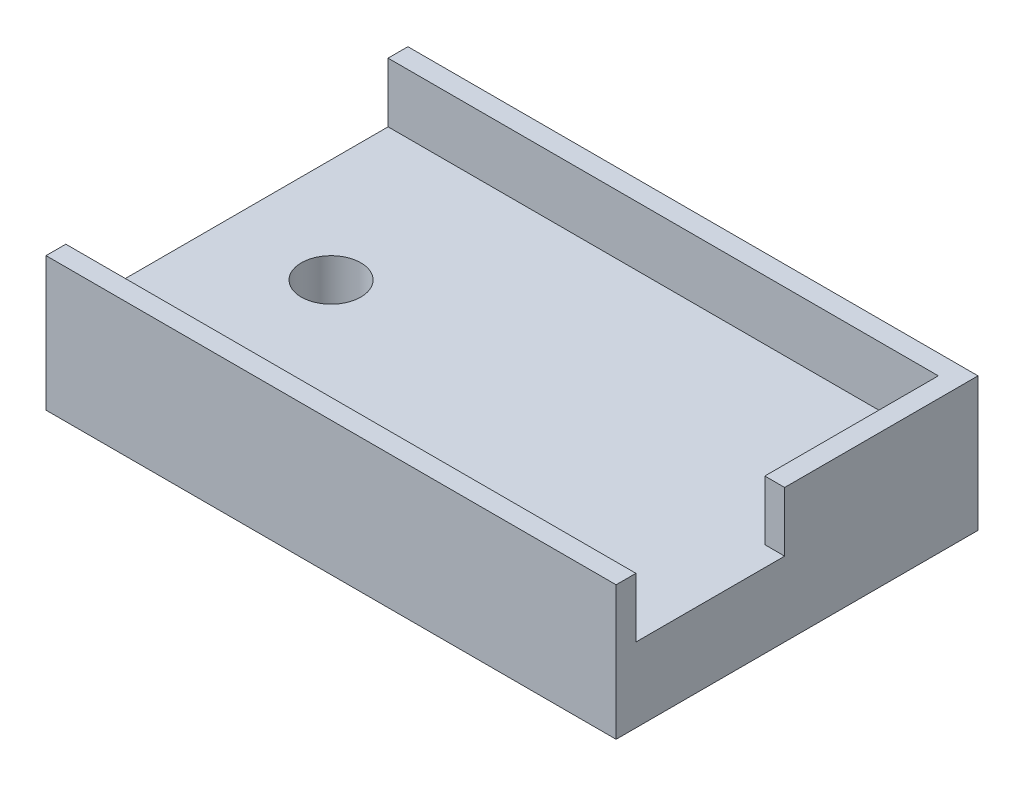
ISO-10303-21;
HEADER;
FILE_DESCRIPTION(('STEP AP214'),'2;1');
FILE_NAME('part.step','',(''),(''),'','','');
FILE_SCHEMA(('AUTOMOTIVE_DESIGN { 1 0 10303 214 1 1 1 1 }'));
ENDSEC;
DATA;
#1=APPLICATION_CONTEXT('core data for automotive mechanical design processes');
#2=APPLICATION_PROTOCOL_DEFINITION('international standard','automotive_design',2000,#1);
#3=PRODUCT_CONTEXT('',#1,'mechanical');
#4=PRODUCT('Part','Part','',(#3));
#5=PRODUCT_RELATED_PRODUCT_CATEGORY('part','',(#4));
#6=PRODUCT_DEFINITION_FORMATION('','',#4);
#7=PRODUCT_DEFINITION_CONTEXT('part definition',#1,'design');
#8=PRODUCT_DEFINITION('design','',#6,#7);
#9=PRODUCT_DEFINITION_SHAPE('','',#8);
#10=(LENGTH_UNIT() NAMED_UNIT(*) SI_UNIT(.MILLI.,.METRE.));
#11=(NAMED_UNIT(*) PLANE_ANGLE_UNIT() SI_UNIT($,.RADIAN.));
#12=(NAMED_UNIT(*) SI_UNIT($,.STERADIAN.) SOLID_ANGLE_UNIT());
#13=UNCERTAINTY_MEASURE_WITH_UNIT(LENGTH_MEASURE(1.E-05),#10,'distance_accuracy_value','');
#14=(GEOMETRIC_REPRESENTATION_CONTEXT(3) GLOBAL_UNCERTAINTY_ASSIGNED_CONTEXT((#13)) GLOBAL_UNIT_ASSIGNED_CONTEXT((#10,
#11,#12)) REPRESENTATION_CONTEXT('',''));
#15=CARTESIAN_POINT('',(0.,0.,0.));
#16=DIRECTION('',(0.,0.,1.));
#17=DIRECTION('',(1.,0.,0.));
#18=AXIS2_PLACEMENT_3D('',#15,#16,#17);
#19=CARTESIAN_POINT('',(11.5,3.,-7.3));
#20=DIRECTION('',(-1.,0.,0.));
#21=DIRECTION('',(0.,0.,1.));
#22=AXIS2_PLACEMENT_3D('',#19,#20,#21);
#23=PLANE('',#22);
#24=DIRECTION('',(0.,0.,-1.));
#25=VECTOR('',#24,1.);
#26=CARTESIAN_POINT('',(11.5,0.,-7.3));
#27=LINE('',#26,#25);
#28=CARTESIAN_POINT('',(11.5,0.,7.3));
#29=VERTEX_POINT('',#28);
#30=CARTESIAN_POINT('',(11.5,0.,-7.3));
#31=VERTEX_POINT('',#30);
#32=EDGE_CURVE('E170',#29,#31,#27,.T.);
#33=ORIENTED_EDGE('',*,*,#32,.T.);
#34=DIRECTION('',(0.,-1.,0.));
#35=VECTOR('',#34,1.);
#36=CARTESIAN_POINT('',(11.5,3.,-7.3));
#37=LINE('',#36,#35);
#38=CARTESIAN_POINT('',(11.5,5.4,-7.3));
#39=VERTEX_POINT('',#38);
#40=EDGE_CURVE('E11',#39,#31,#37,.T.);
#41=ORIENTED_EDGE('',*,*,#40,.F.);
#42=DIRECTION('',(0.,0.,-1.));
#43=VECTOR('',#42,1.);
#44=CARTESIAN_POINT('',(11.5,5.4,-7.3));
#45=LINE('',#44,#43);
#46=CARTESIAN_POINT('',(11.5,5.4,0.499999999999997));
#47=VERTEX_POINT('',#46);
#48=EDGE_CURVE('E209',#47,#39,#45,.T.);
#49=ORIENTED_EDGE('',*,*,#48,.F.);
#50=DIRECTION('',(0.,-1.,0.));
#51=VECTOR('',#50,1.);
#52=CARTESIAN_POINT('',(11.5,5.4,0.499999999999997));
#53=LINE('',#52,#51);
#54=CARTESIAN_POINT('',(11.5,3.,0.499999999999995));
#55=VERTEX_POINT('',#54);
#56=EDGE_CURVE('E207',#47,#55,#53,.T.);
#57=ORIENTED_EDGE('',*,*,#56,.T.);
#58=DIRECTION('',(0.,0.,-1.));
#59=VECTOR('',#58,1.);
#60=CARTESIAN_POINT('',(11.5,3.,-7.3));
#61=LINE('',#60,#59);
#62=CARTESIAN_POINT('',(11.5,3.,6.5));
#63=VERTEX_POINT('',#62);
#64=EDGE_CURVE('E166',#63,#55,#61,.T.);
#65=ORIENTED_EDGE('',*,*,#64,.F.);
#66=DIRECTION('',(0.,-1.,0.));
#67=VECTOR('',#66,1.);
#68=CARTESIAN_POINT('',(11.5,5.4,6.5));
#69=LINE('',#68,#67);
#70=CARTESIAN_POINT('',(11.5,5.4,6.5));
#71=VERTEX_POINT('',#70);
#72=EDGE_CURVE('E150',#71,#63,#69,.T.);
#73=ORIENTED_EDGE('',*,*,#72,.F.);
#74=DIRECTION('',(0.,0.,-1.));
#75=VECTOR('',#74,1.);
#76=CARTESIAN_POINT('',(11.5,5.4,6.5));
#77=LINE('',#76,#75);
#78=CARTESIAN_POINT('',(11.5,5.4,7.3));
#79=VERTEX_POINT('',#78);
#80=EDGE_CURVE('E156',#79,#71,#77,.T.);
#81=ORIENTED_EDGE('',*,*,#80,.F.);
#82=DIRECTION('',(0.,-1.,0.));
#83=VECTOR('',#82,1.);
#84=CARTESIAN_POINT('',(11.5,3.,7.3));
#85=LINE('',#84,#83);
#86=EDGE_CURVE('E175',#79,#29,#85,.T.);
#87=ORIENTED_EDGE('',*,*,#86,.T.);
#88=EDGE_LOOP('',(#33,#41,#49,#57,#65,#73,#81,#87));
#89=FACE_BOUND('',#88,.T.);
#90=ADVANCED_FACE('F39',(#89),#23,.F.);
#91=CARTESIAN_POINT('',(-11.5,3.,-7.3));
#92=DIRECTION('',(0.,0.,1.));
#93=DIRECTION('',(1.,0.,0.));
#94=AXIS2_PLACEMENT_3D('',#91,#92,#93);
#95=PLANE('',#94);
#96=DIRECTION('',(-1.,0.,0.));
#97=VECTOR('',#96,1.);
#98=CARTESIAN_POINT('',(-11.5,0.,-7.3));
#99=LINE('',#98,#97);
#100=CARTESIAN_POINT('',(-11.5,0.,-7.3));
#101=VERTEX_POINT('',#100);
#102=EDGE_CURVE('E177',#31,#101,#99,.T.);
#103=ORIENTED_EDGE('',*,*,#102,.T.);
#104=DIRECTION('',(0.,-1.,0.));
#105=VECTOR('',#104,1.);
#106=CARTESIAN_POINT('',(-11.5,3.,-7.3));
#107=LINE('',#106,#105);
#108=CARTESIAN_POINT('',(-11.5,5.4,-7.3));
#109=VERTEX_POINT('',#108);
#110=EDGE_CURVE('E46',#109,#101,#107,.T.);
#111=ORIENTED_EDGE('',*,*,#110,.F.);
#112=DIRECTION('',(-1.,0.,0.));
#113=VECTOR('',#112,1.);
#114=CARTESIAN_POINT('',(-11.5,5.4,-7.3));
#115=LINE('',#114,#113);
#116=EDGE_CURVE('E134',#39,#109,#115,.T.);
#117=ORIENTED_EDGE('',*,*,#116,.F.);
#118=ORIENTED_EDGE('',*,*,#40,.T.);
#119=EDGE_LOOP('',(#103,#111,#117,#118));
#120=FACE_BOUND('',#119,.T.);
#121=ADVANCED_FACE('F240',(#120),#95,.F.);
#122=CARTESIAN_POINT('',(-11.5,3.,-7.3));
#123=DIRECTION('',(1.,0.,0.));
#124=DIRECTION('',(0.,0.,-1.));
#125=AXIS2_PLACEMENT_3D('',#122,#123,#124);
#126=PLANE('',#125);
#127=DIRECTION('',(0.,0.,1.));
#128=VECTOR('',#127,1.);
#129=CARTESIAN_POINT('',(-11.5,0.,-7.3));
#130=LINE('',#129,#128);
#131=CARTESIAN_POINT('',(-11.5,0.,7.3));
#132=VERTEX_POINT('',#131);
#133=EDGE_CURVE('E179',#101,#132,#130,.T.);
#134=ORIENTED_EDGE('',*,*,#133,.T.);
#135=DIRECTION('',(0.,-1.,0.));
#136=VECTOR('',#135,1.);
#137=CARTESIAN_POINT('',(-11.5,3.,7.3));
#138=LINE('',#137,#136);
#139=CARTESIAN_POINT('',(-11.5,5.4,7.3));
#140=VERTEX_POINT('',#139);
#141=EDGE_CURVE('E181',#140,#132,#138,.T.);
#142=ORIENTED_EDGE('',*,*,#141,.F.);
#143=DIRECTION('',(0.,0.,1.));
#144=VECTOR('',#143,1.);
#145=CARTESIAN_POINT('',(-11.5,5.4,7.3));
#146=LINE('',#145,#144);
#147=CARTESIAN_POINT('',(-11.5,5.4,6.5));
#148=VERTEX_POINT('',#147);
#149=EDGE_CURVE('E157',#148,#140,#146,.T.);
#150=ORIENTED_EDGE('',*,*,#149,.F.);
#151=DIRECTION('',(0.,-1.,0.));
#152=VECTOR('',#151,1.);
#153=CARTESIAN_POINT('',(-11.5,5.4,6.5));
#154=LINE('',#153,#152);
#155=CARTESIAN_POINT('',(-11.5,3.,6.5));
#156=VERTEX_POINT('',#155);
#157=EDGE_CURVE('E147',#148,#156,#154,.T.);
#158=ORIENTED_EDGE('',*,*,#157,.T.);
#159=DIRECTION('',(0.,0.,1.));
#160=VECTOR('',#159,1.);
#161=CARTESIAN_POINT('',(-11.5,3.,-7.3));
#162=LINE('',#161,#160);
#163=CARTESIAN_POINT('',(-11.5,3.,-6.5));
#164=VERTEX_POINT('',#163);
#165=EDGE_CURVE('E140',#164,#156,#162,.T.);
#166=ORIENTED_EDGE('',*,*,#165,.F.);
#167=DIRECTION('',(0.,-1.,0.));
#168=VECTOR('',#167,1.);
#169=CARTESIAN_POINT('',(-11.5,5.4,-6.5));
#170=LINE('',#169,#168);
#171=CARTESIAN_POINT('',(-11.5,5.4,-6.5));
#172=VERTEX_POINT('',#171);
#173=EDGE_CURVE('E120',#172,#164,#170,.T.);
#174=ORIENTED_EDGE('',*,*,#173,.F.);
#175=DIRECTION('',(0.,0.,1.));
#176=VECTOR('',#175,1.);
#177=CARTESIAN_POINT('',(-11.5,5.4,-6.5));
#178=LINE('',#177,#176);
#179=EDGE_CURVE('E121',#109,#172,#178,.T.);
#180=ORIENTED_EDGE('',*,*,#179,.F.);
#181=ORIENTED_EDGE('',*,*,#110,.T.);
#182=EDGE_LOOP('',(#134,#142,#150,#158,#166,#174,#180,#181));
#183=FACE_BOUND('',#182,.T.);
#184=ADVANCED_FACE('F132',(#183),#126,.F.);
#185=CARTESIAN_POINT('',(-11.5,3.,7.3));
#186=DIRECTION('',(0.,0.,-1.));
#187=DIRECTION('',(-1.,0.,0.));
#188=AXIS2_PLACEMENT_3D('',#185,#186,#187);
#189=PLANE('',#188);
#190=DIRECTION('',(1.,0.,0.));
#191=VECTOR('',#190,1.);
#192=CARTESIAN_POINT('',(-11.5,0.,7.3));
#193=LINE('',#192,#191);
#194=EDGE_CURVE('E174',#132,#29,#193,.T.);
#195=ORIENTED_EDGE('',*,*,#194,.T.);
#196=ORIENTED_EDGE('',*,*,#86,.F.);
#197=DIRECTION('',(1.,0.,0.));
#198=VECTOR('',#197,1.);
#199=CARTESIAN_POINT('',(11.5,5.4,7.3));
#200=LINE('',#199,#198);
#201=EDGE_CURVE('E155',#140,#79,#200,.T.);
#202=ORIENTED_EDGE('',*,*,#201,.F.);
#203=ORIENTED_EDGE('',*,*,#141,.T.);
#204=EDGE_LOOP('',(#195,#196,#202,#203));
#205=FACE_BOUND('',#204,.T.);
#206=ADVANCED_FACE('F195',(#205),#189,.F.);
#207=CARTESIAN_POINT('',(0.,3.,0.));
#208=DIRECTION('',(0.,1.,0.));
#209=DIRECTION('',(0.,0.,1.));
#210=AXIS2_PLACEMENT_3D('',#207,#208,#209);
#211=PLANE('',#210);
#212=DIRECTION('',(1.,0.,0.));
#213=VECTOR('',#212,1.);
#214=CARTESIAN_POINT('',(10.7,3.,0.499999999999997));
#215=LINE('',#214,#213);
#216=CARTESIAN_POINT('',(10.7,3.,0.499999999999997));
#217=VERTEX_POINT('',#216);
#218=EDGE_CURVE('E52',#217,#55,#215,.T.);
#219=ORIENTED_EDGE('',*,*,#218,.F.);
#220=DIRECTION('',(0.,0.,1.));
#221=VECTOR('',#220,1.);
#222=CARTESIAN_POINT('',(10.7,3.,0.499999999999997));
#223=LINE('',#222,#221);
#224=CARTESIAN_POINT('',(10.7,3.,-6.5));
#225=VERTEX_POINT('',#224);
#226=EDGE_CURVE('E217',#225,#217,#223,.T.);
#227=ORIENTED_EDGE('',*,*,#226,.F.);
#228=DIRECTION('',(1.,0.,0.));
#229=VECTOR('',#228,1.);
#230=CARTESIAN_POINT('',(10.7,3.,-6.5));
#231=LINE('',#230,#229);
#232=EDGE_CURVE('E56',#164,#225,#231,.T.);
#233=ORIENTED_EDGE('',*,*,#232,.F.);
#234=ORIENTED_EDGE('',*,*,#165,.T.);
#235=DIRECTION('',(-1.,0.,0.));
#236=VECTOR('',#235,1.);
#237=CARTESIAN_POINT('',(11.5,3.,6.5));
#238=LINE('',#237,#236);
#239=EDGE_CURVE('E153',#63,#156,#238,.T.);
#240=ORIENTED_EDGE('',*,*,#239,.F.);
#241=ORIENTED_EDGE('',*,*,#64,.T.);
#242=EDGE_LOOP('',(#219,#227,#233,#234,#240,#241));
#243=FACE_BOUND('',#242,.T.);
#244=CARTESIAN_POINT('',(-7.3,3.,0.));
#245=DIRECTION('',(0.,1.,0.));
#246=DIRECTION('',(0.,0.,1.));
#247=AXIS2_PLACEMENT_3D('',#244,#245,#246);
#248=CIRCLE('',#247,1.2);
#249=CARTESIAN_POINT('',(-7.3,3.,1.2));
#250=VERTEX_POINT('',#249);
#251=EDGE_CURVE('E139',#250,#250,#248,.T.);
#252=ORIENTED_EDGE('',*,*,#251,.F.);
#253=EDGE_LOOP('',(#252));
#254=FACE_BOUND('',#253,.T.);
#255=ADVANCED_FACE('F204',(#243,#254),#211,.T.);
#256=CARTESIAN_POINT('',(0.,0.,0.));
#257=DIRECTION('',(0.,1.,0.));
#258=DIRECTION('',(0.,0.,1.));
#259=AXIS2_PLACEMENT_3D('',#256,#257,#258);
#260=PLANE('',#259);
#261=CARTESIAN_POINT('',(-7.3,0.,0.));
#262=DIRECTION('',(0.,1.,0.));
#263=DIRECTION('',(0.,0.,1.));
#264=AXIS2_PLACEMENT_3D('',#261,#262,#263);
#265=CIRCLE('',#264,1.2);
#266=CARTESIAN_POINT('',(-7.3,0.,1.2));
#267=VERTEX_POINT('',#266);
#268=EDGE_CURVE('E143',#267,#267,#265,.T.);
#269=ORIENTED_EDGE('',*,*,#268,.T.);
#270=EDGE_LOOP('',(#269));
#271=FACE_BOUND('',#270,.T.);
#272=ORIENTED_EDGE('',*,*,#32,.F.);
#273=ORIENTED_EDGE('',*,*,#194,.F.);
#274=ORIENTED_EDGE('',*,*,#133,.F.);
#275=ORIENTED_EDGE('',*,*,#102,.F.);
#276=EDGE_LOOP('',(#272,#273,#274,#275));
#277=FACE_BOUND('',#276,.T.);
#278=ADVANCED_FACE('F187',(#271,#277),#260,.F.);
#279=CARTESIAN_POINT('',(-7.3,0.,0.));
#280=DIRECTION('',(0.,1.,0.));
#281=DIRECTION('',(0.,0.,1.));
#282=AXIS2_PLACEMENT_3D('',#279,#280,#281);
#283=CYLINDRICAL_SURFACE('',#282,1.2);
#284=ORIENTED_EDGE('',*,*,#268,.F.);
#285=EDGE_LOOP('',(#284));
#286=FACE_BOUND('',#285,.T.);
#287=ORIENTED_EDGE('',*,*,#251,.T.);
#288=EDGE_LOOP('',(#287));
#289=FACE_BOUND('',#288,.T.);
#290=ADVANCED_FACE('F253',(#286,#289),#283,.F.);
#291=CARTESIAN_POINT('',(11.5,5.4,6.5));
#292=DIRECTION('',(0.,0.,1.));
#293=DIRECTION('',(1.,0.,0.));
#294=AXIS2_PLACEMENT_3D('',#291,#292,#293);
#295=PLANE('',#294);
#296=ORIENTED_EDGE('',*,*,#239,.T.);
#297=ORIENTED_EDGE('',*,*,#157,.F.);
#298=DIRECTION('',(-1.,0.,0.));
#299=VECTOR('',#298,1.);
#300=CARTESIAN_POINT('',(11.5,5.4,6.5));
#301=LINE('',#300,#299);
#302=EDGE_CURVE('E165',#71,#148,#301,.T.);
#303=ORIENTED_EDGE('',*,*,#302,.F.);
#304=ORIENTED_EDGE('',*,*,#72,.T.);
#305=EDGE_LOOP('',(#296,#297,#303,#304));
#306=FACE_BOUND('',#305,.T.);
#307=ADVANCED_FACE('F201',(#306),#295,.F.);
#308=CARTESIAN_POINT('',(0.,5.4,0.));
#309=DIRECTION('',(0.,-1.,0.));
#310=DIRECTION('',(0.,0.,-1.));
#311=AXIS2_PLACEMENT_3D('',#308,#309,#310);
#312=PLANE('',#311);
#313=ORIENTED_EDGE('',*,*,#80,.T.);
#314=ORIENTED_EDGE('',*,*,#302,.T.);
#315=ORIENTED_EDGE('',*,*,#149,.T.);
#316=ORIENTED_EDGE('',*,*,#201,.T.);
#317=EDGE_LOOP('',(#313,#314,#315,#316));
#318=FACE_BOUND('',#317,.T.);
#319=ADVANCED_FACE('F200',(#318),#312,.F.);
#320=CARTESIAN_POINT('',(10.7,5.4,-6.5));
#321=DIRECTION('',(0.,0.,-1.));
#322=DIRECTION('',(-1.,0.,0.));
#323=AXIS2_PLACEMENT_3D('',#320,#321,#322);
#324=PLANE('',#323);
#325=ORIENTED_EDGE('',*,*,#232,.T.);
#326=DIRECTION('',(0.,-1.,0.));
#327=VECTOR('',#326,1.);
#328=CARTESIAN_POINT('',(10.7,5.4,-6.5));
#329=LINE('',#328,#327);
#330=CARTESIAN_POINT('',(10.7,5.4,-6.5));
#331=VERTEX_POINT('',#330);
#332=EDGE_CURVE('E117',#331,#225,#329,.T.);
#333=ORIENTED_EDGE('',*,*,#332,.F.);
#334=DIRECTION('',(1.,0.,0.));
#335=VECTOR('',#334,1.);
#336=CARTESIAN_POINT('',(10.7,5.4,-6.5));
#337=LINE('',#336,#335);
#338=EDGE_CURVE('E111',#172,#331,#337,.T.);
#339=ORIENTED_EDGE('',*,*,#338,.F.);
#340=ORIENTED_EDGE('',*,*,#173,.T.);
#341=EDGE_LOOP('',(#325,#333,#339,#340));
#342=FACE_BOUND('',#341,.T.);
#343=ADVANCED_FACE('F119',(#342),#324,.F.);
#344=CARTESIAN_POINT('',(10.7,5.4,0.499999999999997));
#345=DIRECTION('',(1.,0.,0.));
#346=DIRECTION('',(0.,0.,-1.));
#347=AXIS2_PLACEMENT_3D('',#344,#345,#346);
#348=PLANE('',#347);
#349=ORIENTED_EDGE('',*,*,#226,.T.);
#350=DIRECTION('',(0.,-1.,0.));
#351=VECTOR('',#350,1.);
#352=CARTESIAN_POINT('',(10.7,5.4,0.499999999999997));
#353=LINE('',#352,#351);
#354=CARTESIAN_POINT('',(10.7,5.4,0.499999999999997));
#355=VERTEX_POINT('',#354);
#356=EDGE_CURVE('E141',#355,#217,#353,.T.);
#357=ORIENTED_EDGE('',*,*,#356,.F.);
#358=DIRECTION('',(0.,0.,1.));
#359=VECTOR('',#358,1.);
#360=CARTESIAN_POINT('',(10.7,5.4,0.499999999999997));
#361=LINE('',#360,#359);
#362=EDGE_CURVE('E124',#331,#355,#361,.T.);
#363=ORIENTED_EDGE('',*,*,#362,.F.);
#364=ORIENTED_EDGE('',*,*,#332,.T.);
#365=EDGE_LOOP('',(#349,#357,#363,#364));
#366=FACE_BOUND('',#365,.T.);
#367=ADVANCED_FACE('F229',(#366),#348,.F.);
#368=CARTESIAN_POINT('',(10.7,5.4,0.499999999999997));
#369=DIRECTION('',(0.,0.,-1.));
#370=DIRECTION('',(-1.,0.,0.));
#371=AXIS2_PLACEMENT_3D('',#368,#369,#370);
#372=PLANE('',#371);
#373=ORIENTED_EDGE('',*,*,#218,.T.);
#374=ORIENTED_EDGE('',*,*,#56,.F.);
#375=DIRECTION('',(1.,0.,0.));
#376=VECTOR('',#375,1.);
#377=CARTESIAN_POINT('',(10.7,5.4,0.499999999999997));
#378=LINE('',#377,#376);
#379=EDGE_CURVE('E225',#355,#47,#378,.T.);
#380=ORIENTED_EDGE('',*,*,#379,.F.);
#381=ORIENTED_EDGE('',*,*,#356,.T.);
#382=EDGE_LOOP('',(#373,#374,#380,#381));
#383=FACE_BOUND('',#382,.T.);
#384=ADVANCED_FACE('F226',(#383),#372,.F.);
#385=CARTESIAN_POINT('',(0.,5.4,0.));
#386=DIRECTION('',(0.,-1.,0.));
#387=DIRECTION('',(0.,0.,-1.));
#388=AXIS2_PLACEMENT_3D('',#385,#386,#387);
#389=PLANE('',#388);
#390=ORIENTED_EDGE('',*,*,#179,.T.);
#391=ORIENTED_EDGE('',*,*,#338,.T.);
#392=ORIENTED_EDGE('',*,*,#362,.T.);
#393=ORIENTED_EDGE('',*,*,#379,.T.);
#394=ORIENTED_EDGE('',*,*,#48,.T.);
#395=ORIENTED_EDGE('',*,*,#116,.T.);
#396=EDGE_LOOP('',(#390,#391,#392,#393,#394,#395));
#397=FACE_BOUND('',#396,.T.);
#398=ADVANCED_FACE('F126',(#397),#389,.F.);
#399=CLOSED_SHELL('',(#90,#121,#184,#206,#255,#278,#290,#307,#319,#343,#367,#384,#398));
#400=MANIFOLD_SOLID_BREP('B2',#399);
#401=ADVANCED_BREP_SHAPE_REPRESENTATION('',(#18,#400),#14);
#402=SHAPE_DEFINITION_REPRESENTATION(#9,#401);
ENDSEC;
END-ISO-10303-21;
